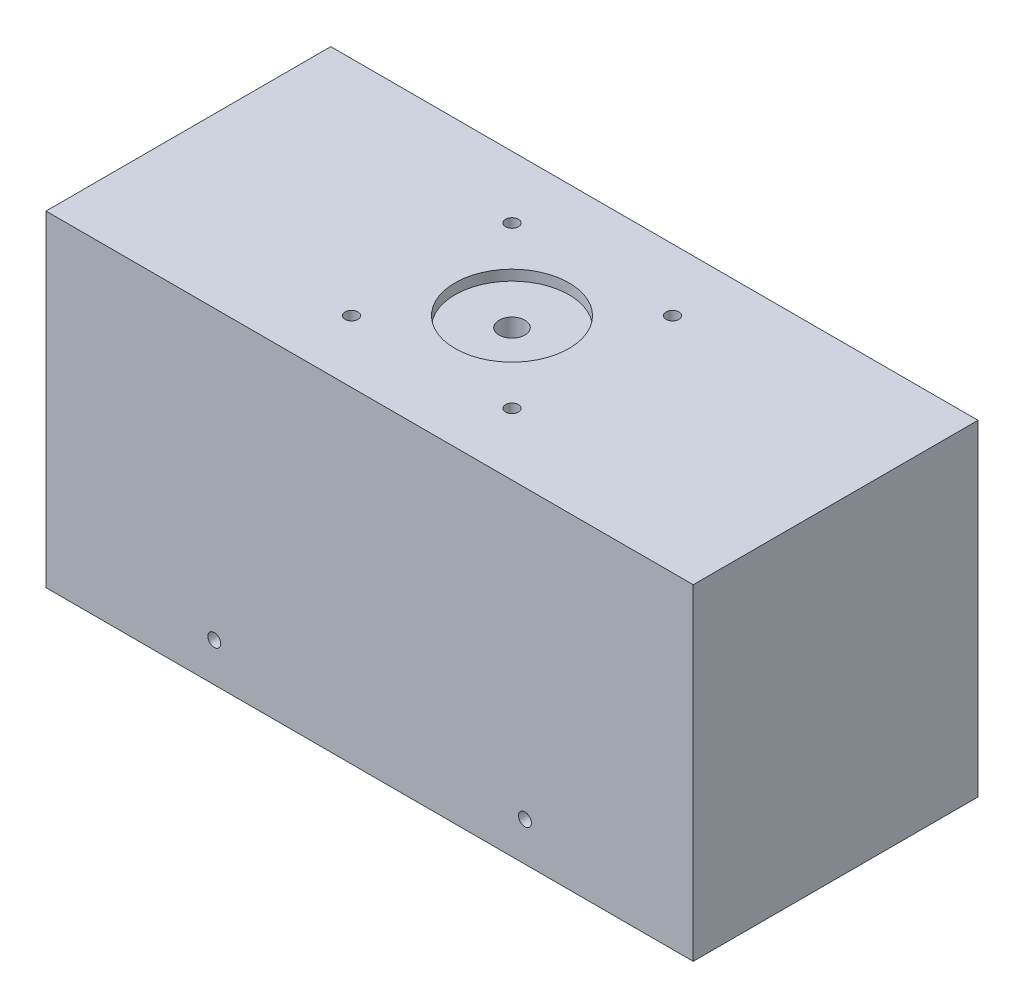
ISO-10303-21;
HEADER;
FILE_DESCRIPTION(('STEP AP214'),'2;1');
FILE_NAME('part.step','',(''),(''),'','','');
FILE_SCHEMA(('AUTOMOTIVE_DESIGN { 1 0 10303 214 1 1 1 1 }'));
ENDSEC;
DATA;
#1=APPLICATION_CONTEXT('core data for automotive mechanical design processes');
#2=APPLICATION_PROTOCOL_DEFINITION('international standard','automotive_design',2000,#1);
#3=PRODUCT_CONTEXT('',#1,'mechanical');
#4=PRODUCT('Part','Part','',(#3));
#5=PRODUCT_RELATED_PRODUCT_CATEGORY('part','',(#4));
#6=PRODUCT_DEFINITION_FORMATION('','',#4);
#7=PRODUCT_DEFINITION_CONTEXT('part definition',#1,'design');
#8=PRODUCT_DEFINITION('design','',#6,#7);
#9=PRODUCT_DEFINITION_SHAPE('','',#8);
#10=(LENGTH_UNIT() NAMED_UNIT(*) SI_UNIT(.MILLI.,.METRE.));
#11=(NAMED_UNIT(*) PLANE_ANGLE_UNIT() SI_UNIT($,.RADIAN.));
#12=(NAMED_UNIT(*) SI_UNIT($,.STERADIAN.) SOLID_ANGLE_UNIT());
#13=UNCERTAINTY_MEASURE_WITH_UNIT(LENGTH_MEASURE(1.E-05),#10,'distance_accuracy_value','');
#14=(GEOMETRIC_REPRESENTATION_CONTEXT(3) GLOBAL_UNCERTAINTY_ASSIGNED_CONTEXT((#13)) GLOBAL_UNIT_ASSIGNED_CONTEXT((#10,
#11,#12)) REPRESENTATION_CONTEXT('',''));
#15=CARTESIAN_POINT('',(0.,0.,0.));
#16=DIRECTION('',(0.,0.,1.));
#17=DIRECTION('',(1.,0.,0.));
#18=AXIS2_PLACEMENT_3D('',#15,#16,#17);
#19=CARTESIAN_POINT('',(-62.5,6.,27.5));
#20=DIRECTION('',(0.,0.,-1.));
#21=DIRECTION('',(-1.,0.,0.));
#22=AXIS2_PLACEMENT_3D('',#19,#20,#21);
#23=PLANE('',#22);
#24=DIRECTION('',(0.,-1.,0.));
#25=VECTOR('',#24,1.);
#26=CARTESIAN_POINT('',(-62.5,6.,27.5));
#27=LINE('',#26,#25);
#28=CARTESIAN_POINT('',(-62.5,6.,27.5));
#29=VERTEX_POINT('',#28);
#30=CARTESIAN_POINT('',(-62.5,-57.,27.5));
#31=VERTEX_POINT('',#30);
#32=EDGE_CURVE('E197',#29,#31,#27,.T.);
#33=ORIENTED_EDGE('',*,*,#32,.T.);
#34=DIRECTION('',(-1.,0.,0.));
#35=VECTOR('',#34,1.);
#36=CARTESIAN_POINT('',(62.5,-57.,27.5));
#37=LINE('',#36,#35);
#38=CARTESIAN_POINT('',(62.5,-57.,27.5));
#39=VERTEX_POINT('',#38);
#40=EDGE_CURVE('E156',#39,#31,#37,.T.);
#41=ORIENTED_EDGE('',*,*,#40,.F.);
#42=DIRECTION('',(0.,-1.,0.));
#43=VECTOR('',#42,1.);
#44=CARTESIAN_POINT('',(62.5,6.,27.5));
#45=LINE('',#44,#43);
#46=CARTESIAN_POINT('',(62.5,6.,27.5));
#47=VERTEX_POINT('',#46);
#48=EDGE_CURVE('E195',#47,#39,#45,.T.);
#49=ORIENTED_EDGE('',*,*,#48,.F.);
#50=DIRECTION('',(1.,0.,0.));
#51=VECTOR('',#50,1.);
#52=CARTESIAN_POINT('',(-62.5,6.,27.5));
#53=LINE('',#52,#51);
#54=EDGE_CURVE('E63',#29,#47,#53,.T.);
#55=ORIENTED_EDGE('',*,*,#54,.F.);
#56=EDGE_LOOP('',(#33,#41,#49,#55));
#57=FACE_BOUND('',#56,.T.);
#58=CARTESIAN_POINT('',(-30.,-49.5,27.5));
#59=DIRECTION('',(0.,0.,1.));
#60=DIRECTION('',(1.,0.,0.));
#61=AXIS2_PLACEMENT_3D('',#58,#59,#60);
#62=CIRCLE('',#61,1.24999999999999);
#63=CARTESIAN_POINT('',(-28.75,-49.5,27.5));
#64=VERTEX_POINT('',#63);
#65=EDGE_CURVE('E297',#64,#64,#62,.T.);
#66=ORIENTED_EDGE('',*,*,#65,.F.);
#67=EDGE_LOOP('',(#66));
#68=FACE_BOUND('',#67,.T.);
#69=CARTESIAN_POINT('',(30.,-49.5,27.5));
#70=DIRECTION('',(0.,0.,1.));
#71=DIRECTION('',(1.,0.,0.));
#72=AXIS2_PLACEMENT_3D('',#69,#70,#71);
#73=CIRCLE('',#72,1.24999999999999);
#74=CARTESIAN_POINT('',(31.25,-49.5,27.5));
#75=VERTEX_POINT('',#74);
#76=EDGE_CURVE('E293',#75,#75,#73,.T.);
#77=ORIENTED_EDGE('',*,*,#76,.F.);
#78=EDGE_LOOP('',(#77));
#79=FACE_BOUND('',#78,.T.);
#80=ADVANCED_FACE('F38',(#57,#68,#79),#23,.F.);
#81=CARTESIAN_POINT('',(-62.5,6.,-27.5));
#82=DIRECTION('',(0.,0.,1.));
#83=DIRECTION('',(1.,0.,0.));
#84=AXIS2_PLACEMENT_3D('',#81,#82,#83);
#85=PLANE('',#84);
#86=DIRECTION('',(0.,-1.,0.));
#87=VECTOR('',#86,1.);
#88=CARTESIAN_POINT('',(62.5,6.,-27.5));
#89=LINE('',#88,#87);
#90=CARTESIAN_POINT('',(62.5,6.,-27.5));
#91=VERTEX_POINT('',#90);
#92=CARTESIAN_POINT('',(62.5,-57.,-27.5));
#93=VERTEX_POINT('',#92);
#94=EDGE_CURVE('E11',#91,#93,#89,.T.);
#95=ORIENTED_EDGE('',*,*,#94,.T.);
#96=DIRECTION('',(1.,0.,0.));
#97=VECTOR('',#96,1.);
#98=CARTESIAN_POINT('',(62.5,-57.,-27.5));
#99=LINE('',#98,#97);
#100=CARTESIAN_POINT('',(-62.5,-57.,-27.5));
#101=VERTEX_POINT('',#100);
#102=EDGE_CURVE('E150',#101,#93,#99,.T.);
#103=ORIENTED_EDGE('',*,*,#102,.F.);
#104=DIRECTION('',(0.,-1.,0.));
#105=VECTOR('',#104,1.);
#106=CARTESIAN_POINT('',(-62.5,6.,-27.5));
#107=LINE('',#106,#105);
#108=CARTESIAN_POINT('',(-62.5,6.,-27.5));
#109=VERTEX_POINT('',#108);
#110=EDGE_CURVE('E47',#109,#101,#107,.T.);
#111=ORIENTED_EDGE('',*,*,#110,.F.);
#112=DIRECTION('',(-1.,0.,0.));
#113=VECTOR('',#112,1.);
#114=CARTESIAN_POINT('',(-62.5,6.,-27.5));
#115=LINE('',#114,#113);
#116=EDGE_CURVE('E190',#91,#109,#115,.T.);
#117=ORIENTED_EDGE('',*,*,#116,.F.);
#118=EDGE_LOOP('',(#95,#103,#111,#117));
#119=FACE_BOUND('',#118,.T.);
#120=CARTESIAN_POINT('',(30.,-49.5,-27.5));
#121=DIRECTION('',(0.,0.,-1.));
#122=DIRECTION('',(-1.,0.,0.));
#123=AXIS2_PLACEMENT_3D('',#120,#121,#122);
#124=CIRCLE('',#123,1.24999999999999);
#125=CARTESIAN_POINT('',(28.75,-49.5,-27.5));
#126=VERTEX_POINT('',#125);
#127=EDGE_CURVE('E312',#126,#126,#124,.T.);
#128=ORIENTED_EDGE('',*,*,#127,.F.);
#129=EDGE_LOOP('',(#128));
#130=FACE_BOUND('',#129,.T.);
#131=CARTESIAN_POINT('',(-30.,-49.5,-27.5));
#132=DIRECTION('',(0.,0.,-1.));
#133=DIRECTION('',(-1.,0.,0.));
#134=AXIS2_PLACEMENT_3D('',#131,#132,#133);
#135=CIRCLE('',#134,1.24999999999999);
#136=CARTESIAN_POINT('',(-31.25,-49.5,-27.5));
#137=VERTEX_POINT('',#136);
#138=EDGE_CURVE('E306',#137,#137,#135,.T.);
#139=ORIENTED_EDGE('',*,*,#138,.F.);
#140=EDGE_LOOP('',(#139));
#141=FACE_BOUND('',#140,.T.);
#142=ADVANCED_FACE('F223',(#119,#130,#141),#85,.F.);
#143=CARTESIAN_POINT('',(62.5,6.,-27.5));
#144=DIRECTION('',(-1.,0.,0.));
#145=DIRECTION('',(0.,0.,1.));
#146=AXIS2_PLACEMENT_3D('',#143,#144,#145);
#147=PLANE('',#146);
#148=ORIENTED_EDGE('',*,*,#48,.T.);
#149=DIRECTION('',(0.,0.,1.));
#150=VECTOR('',#149,1.);
#151=CARTESIAN_POINT('',(62.5,-57.,-27.5));
#152=LINE('',#151,#150);
#153=EDGE_CURVE('E153',#93,#39,#152,.T.);
#154=ORIENTED_EDGE('',*,*,#153,.F.);
#155=ORIENTED_EDGE('',*,*,#94,.F.);
#156=DIRECTION('',(0.,0.,-1.));
#157=VECTOR('',#156,1.);
#158=CARTESIAN_POINT('',(62.5,6.,-27.5));
#159=LINE('',#158,#157);
#160=EDGE_CURVE('E186',#47,#91,#159,.T.);
#161=ORIENTED_EDGE('',*,*,#160,.F.);
#162=EDGE_LOOP('',(#148,#154,#155,#161));
#163=FACE_BOUND('',#162,.T.);
#164=ADVANCED_FACE('F40',(#163),#147,.F.);
#165=CARTESIAN_POINT('',(-62.5,6.,-27.5));
#166=DIRECTION('',(1.,0.,0.));
#167=DIRECTION('',(0.,0.,-1.));
#168=AXIS2_PLACEMENT_3D('',#165,#166,#167);
#169=PLANE('',#168);
#170=ORIENTED_EDGE('',*,*,#110,.T.);
#171=DIRECTION('',(0.,0.,-1.));
#172=VECTOR('',#171,1.);
#173=CARTESIAN_POINT('',(-62.5,-57.,-27.5));
#174=LINE('',#173,#172);
#175=EDGE_CURVE('E122',#31,#101,#174,.T.);
#176=ORIENTED_EDGE('',*,*,#175,.F.);
#177=ORIENTED_EDGE('',*,*,#32,.F.);
#178=DIRECTION('',(0.,0.,1.));
#179=VECTOR('',#178,1.);
#180=CARTESIAN_POINT('',(-62.5,6.,-27.5));
#181=LINE('',#180,#179);
#182=EDGE_CURVE('E192',#109,#29,#181,.T.);
#183=ORIENTED_EDGE('',*,*,#182,.F.);
#184=EDGE_LOOP('',(#170,#176,#177,#183));
#185=FACE_BOUND('',#184,.T.);
#186=ADVANCED_FACE('F234',(#185),#169,.F.);
#187=CARTESIAN_POINT('',(0.,6.,0.));
#188=DIRECTION('',(0.,1.,0.));
#189=DIRECTION('',(0.,0.,1.));
#190=AXIS2_PLACEMENT_3D('',#187,#188,#189);
#191=PLANE('',#190);
#192=CARTESIAN_POINT('',(15.5,6.,-15.5));
#193=DIRECTION('',(0.,1.,0.));
#194=DIRECTION('',(0.,0.,1.));
#195=AXIS2_PLACEMENT_3D('',#192,#193,#194);
#196=CIRCLE('',#195,1.24999999999999);
#197=CARTESIAN_POINT('',(15.5,6.,-14.25));
#198=VERTEX_POINT('',#197);
#199=EDGE_CURVE('E159',#198,#198,#196,.T.);
#200=ORIENTED_EDGE('',*,*,#199,.F.);
#201=EDGE_LOOP('',(#200));
#202=FACE_BOUND('',#201,.T.);
#203=CARTESIAN_POINT('',(15.5,6.,15.5));
#204=DIRECTION('',(0.,1.,0.));
#205=DIRECTION('',(0.,0.,1.));
#206=AXIS2_PLACEMENT_3D('',#203,#204,#205);
#207=CIRCLE('',#206,1.24999999999999);
#208=CARTESIAN_POINT('',(15.5,6.,16.75));
#209=VERTEX_POINT('',#208);
#210=EDGE_CURVE('E162',#209,#209,#207,.T.);
#211=ORIENTED_EDGE('',*,*,#210,.F.);
#212=EDGE_LOOP('',(#211));
#213=FACE_BOUND('',#212,.T.);
#214=CARTESIAN_POINT('',(-15.5,6.,15.5));
#215=DIRECTION('',(0.,1.,0.));
#216=DIRECTION('',(0.,0.,1.));
#217=AXIS2_PLACEMENT_3D('',#214,#215,#216);
#218=CIRCLE('',#217,1.24999999999999);
#219=CARTESIAN_POINT('',(-15.5,6.,16.75));
#220=VERTEX_POINT('',#219);
#221=EDGE_CURVE('E166',#220,#220,#218,.T.);
#222=ORIENTED_EDGE('',*,*,#221,.F.);
#223=EDGE_LOOP('',(#222));
#224=FACE_BOUND('',#223,.T.);
#225=CARTESIAN_POINT('',(-15.5,6.,-15.5));
#226=DIRECTION('',(0.,1.,0.));
#227=DIRECTION('',(0.,0.,1.));
#228=AXIS2_PLACEMENT_3D('',#225,#226,#227);
#229=CIRCLE('',#228,1.24999999999999);
#230=CARTESIAN_POINT('',(-15.5,6.,-14.25));
#231=VERTEX_POINT('',#230);
#232=EDGE_CURVE('E172',#231,#231,#229,.T.);
#233=ORIENTED_EDGE('',*,*,#232,.F.);
#234=EDGE_LOOP('',(#233));
#235=FACE_BOUND('',#234,.T.);
#236=CARTESIAN_POINT('',(0.,6.,0.));
#237=DIRECTION('',(0.,1.,0.));
#238=DIRECTION('',(0.,0.,1.));
#239=AXIS2_PLACEMENT_3D('',#236,#237,#238);
#240=CIRCLE('',#239,11.);
#241=CARTESIAN_POINT('',(0.,6.,11.));
#242=VERTEX_POINT('',#241);
#243=EDGE_CURVE('E182',#242,#242,#240,.T.);
#244=ORIENTED_EDGE('',*,*,#243,.F.);
#245=EDGE_LOOP('',(#244));
#246=FACE_BOUND('',#245,.T.);
#247=ORIENTED_EDGE('',*,*,#160,.T.);
#248=ORIENTED_EDGE('',*,*,#116,.T.);
#249=ORIENTED_EDGE('',*,*,#182,.T.);
#250=ORIENTED_EDGE('',*,*,#54,.T.);
#251=EDGE_LOOP('',(#247,#248,#249,#250));
#252=FACE_BOUND('',#251,.T.);
#253=ADVANCED_FACE('F236',(#202,#213,#224,#235,#246,#252),#191,.T.);
#254=CARTESIAN_POINT('',(0.,0.,0.));
#255=DIRECTION('',(0.,1.,0.));
#256=DIRECTION('',(0.,0.,1.));
#257=AXIS2_PLACEMENT_3D('',#254,#255,#256);
#258=PLANE('',#257);
#259=DIRECTION('',(-1.,0.,0.));
#260=VECTOR('',#259,1.);
#261=CARTESIAN_POINT('',(60.,0.,25.));
#262=LINE('',#261,#260);
#263=CARTESIAN_POINT('',(60.,0.,25.));
#264=VERTEX_POINT('',#263);
#265=CARTESIAN_POINT('',(-60.,0.,25.));
#266=VERTEX_POINT('',#265);
#267=EDGE_CURVE('E115',#264,#266,#262,.T.);
#268=ORIENTED_EDGE('',*,*,#267,.T.);
#269=DIRECTION('',(0.,0.,-1.));
#270=VECTOR('',#269,1.);
#271=CARTESIAN_POINT('',(-60.,0.,-25.));
#272=LINE('',#271,#270);
#273=CARTESIAN_POINT('',(-60.,0.,-25.));
#274=VERTEX_POINT('',#273);
#275=EDGE_CURVE('E135',#266,#274,#272,.T.);
#276=ORIENTED_EDGE('',*,*,#275,.T.);
#277=DIRECTION('',(1.,0.,0.));
#278=VECTOR('',#277,1.);
#279=CARTESIAN_POINT('',(60.,0.,-25.));
#280=LINE('',#279,#278);
#281=CARTESIAN_POINT('',(60.,0.,-25.));
#282=VERTEX_POINT('',#281);
#283=EDGE_CURVE('E121',#274,#282,#280,.T.);
#284=ORIENTED_EDGE('',*,*,#283,.T.);
#285=DIRECTION('',(0.,0.,1.));
#286=VECTOR('',#285,1.);
#287=CARTESIAN_POINT('',(60.,0.,-25.));
#288=LINE('',#287,#286);
#289=EDGE_CURVE('E139',#282,#264,#288,.T.);
#290=ORIENTED_EDGE('',*,*,#289,.T.);
#291=EDGE_LOOP('',(#268,#276,#284,#290));
#292=FACE_BOUND('',#291,.T.);
#293=CARTESIAN_POINT('',(15.5,0.,-15.5));
#294=DIRECTION('',(0.,1.,0.));
#295=DIRECTION('',(0.,0.,1.));
#296=AXIS2_PLACEMENT_3D('',#293,#294,#295);
#297=CIRCLE('',#296,1.24999999999999);
#298=CARTESIAN_POINT('',(15.5,0.,-14.25));
#299=VERTEX_POINT('',#298);
#300=EDGE_CURVE('E42',#299,#299,#297,.T.);
#301=ORIENTED_EDGE('',*,*,#300,.T.);
#302=EDGE_LOOP('',(#301));
#303=FACE_BOUND('',#302,.T.);
#304=CARTESIAN_POINT('',(15.5,0.,15.5));
#305=DIRECTION('',(0.,1.,0.));
#306=DIRECTION('',(0.,0.,1.));
#307=AXIS2_PLACEMENT_3D('',#304,#305,#306);
#308=CIRCLE('',#307,1.24999999999999);
#309=CARTESIAN_POINT('',(15.5,0.,16.75));
#310=VERTEX_POINT('',#309);
#311=EDGE_CURVE('E165',#310,#310,#308,.T.);
#312=ORIENTED_EDGE('',*,*,#311,.T.);
#313=EDGE_LOOP('',(#312));
#314=FACE_BOUND('',#313,.T.);
#315=CARTESIAN_POINT('',(-15.5,0.,15.5));
#316=DIRECTION('',(0.,1.,0.));
#317=DIRECTION('',(0.,0.,1.));
#318=AXIS2_PLACEMENT_3D('',#315,#316,#317);
#319=CIRCLE('',#318,1.24999999999999);
#320=CARTESIAN_POINT('',(-15.5,0.,16.75));
#321=VERTEX_POINT('',#320);
#322=EDGE_CURVE('E169',#321,#321,#319,.T.);
#323=ORIENTED_EDGE('',*,*,#322,.T.);
#324=EDGE_LOOP('',(#323));
#325=FACE_BOUND('',#324,.T.);
#326=CARTESIAN_POINT('',(-15.5,0.,-15.5));
#327=DIRECTION('',(0.,1.,0.));
#328=DIRECTION('',(0.,0.,1.));
#329=AXIS2_PLACEMENT_3D('',#326,#327,#328);
#330=CIRCLE('',#329,1.24999999999999);
#331=CARTESIAN_POINT('',(-15.5,0.,-14.25));
#332=VERTEX_POINT('',#331);
#333=EDGE_CURVE('E175',#332,#332,#330,.T.);
#334=ORIENTED_EDGE('',*,*,#333,.T.);
#335=EDGE_LOOP('',(#334));
#336=FACE_BOUND('',#335,.T.);
#337=CARTESIAN_POINT('',(0.,0.,0.));
#338=DIRECTION('',(0.,1.,0.));
#339=DIRECTION('',(0.,0.,1.));
#340=AXIS2_PLACEMENT_3D('',#337,#338,#339);
#341=CIRCLE('',#340,2.5);
#342=CARTESIAN_POINT('',(0.,0.,2.5));
#343=VERTEX_POINT('',#342);
#344=EDGE_CURVE('E179',#343,#343,#341,.F.);
#345=ORIENTED_EDGE('',*,*,#344,.F.);
#346=EDGE_LOOP('',(#345));
#347=FACE_BOUND('',#346,.T.);
#348=ADVANCED_FACE('F204',(#292,#303,#314,#325,#336,#347),#258,.F.);
#349=CARTESIAN_POINT('',(0.,4.,0.));
#350=DIRECTION('',(0.,1.,0.));
#351=DIRECTION('',(0.,0.,1.));
#352=AXIS2_PLACEMENT_3D('',#349,#350,#351);
#353=CYLINDRICAL_SURFACE('',#352,11.);
#354=CARTESIAN_POINT('',(0.,4.,0.));
#355=DIRECTION('',(0.,1.,0.));
#356=DIRECTION('',(0.,0.,1.));
#357=AXIS2_PLACEMENT_3D('',#354,#355,#356);
#358=CIRCLE('',#357,11.);
#359=CARTESIAN_POINT('',(0.,4.,11.));
#360=VERTEX_POINT('',#359);
#361=EDGE_CURVE('E183',#360,#360,#358,.T.);
#362=ORIENTED_EDGE('',*,*,#361,.F.);
#363=EDGE_LOOP('',(#362));
#364=FACE_BOUND('',#363,.T.);
#365=ORIENTED_EDGE('',*,*,#243,.T.);
#366=EDGE_LOOP('',(#365));
#367=FACE_BOUND('',#366,.T.);
#368=ADVANCED_FACE('F330',(#364,#367),#353,.F.);
#369=CARTESIAN_POINT('',(0.,4.,0.));
#370=DIRECTION('',(0.,1.,0.));
#371=DIRECTION('',(0.,0.,1.));
#372=AXIS2_PLACEMENT_3D('',#369,#370,#371);
#373=PLANE('',#372);
#374=CARTESIAN_POINT('',(0.,4.,0.));
#375=DIRECTION('',(0.,1.,0.));
#376=DIRECTION('',(0.,0.,1.));
#377=AXIS2_PLACEMENT_3D('',#374,#375,#376);
#378=CIRCLE('',#377,2.5);
#379=CARTESIAN_POINT('',(0.,4.,2.5));
#380=VERTEX_POINT('',#379);
#381=EDGE_CURVE('E176',#380,#380,#378,.T.);
#382=ORIENTED_EDGE('',*,*,#381,.F.);
#383=EDGE_LOOP('',(#382));
#384=FACE_BOUND('',#383,.T.);
#385=ORIENTED_EDGE('',*,*,#361,.T.);
#386=EDGE_LOOP('',(#385));
#387=FACE_BOUND('',#386,.T.);
#388=ADVANCED_FACE('F337',(#384,#387),#373,.T.);
#389=CARTESIAN_POINT('',(0.,-0.00100000000000013,0.));
#390=DIRECTION('',(0.,1.,0.));
#391=DIRECTION('',(0.,0.,1.));
#392=AXIS2_PLACEMENT_3D('',#389,#390,#391);
#393=CYLINDRICAL_SURFACE('',#392,2.5);
#394=ORIENTED_EDGE('',*,*,#381,.T.);
#395=EDGE_LOOP('',(#394));
#396=FACE_BOUND('',#395,.T.);
#397=ORIENTED_EDGE('',*,*,#344,.T.);
#398=EDGE_LOOP('',(#397));
#399=FACE_BOUND('',#398,.T.);
#400=ADVANCED_FACE('F343',(#396,#399),#393,.F.);
#401=CARTESIAN_POINT('',(-15.5,6.,-15.5));
#402=DIRECTION('',(0.,1.,0.));
#403=DIRECTION('',(0.,0.,1.));
#404=AXIS2_PLACEMENT_3D('',#401,#402,#403);
#405=CYLINDRICAL_SURFACE('',#404,1.24999999999999);
#406=ORIENTED_EDGE('',*,*,#232,.T.);
#407=EDGE_LOOP('',(#406));
#408=FACE_BOUND('',#407,.T.);
#409=ORIENTED_EDGE('',*,*,#333,.F.);
#410=EDGE_LOOP('',(#409));
#411=FACE_BOUND('',#410,.T.);
#412=ADVANCED_FACE('F219',(#408,#411),#405,.F.);
#413=CARTESIAN_POINT('',(-15.5,6.,15.5));
#414=DIRECTION('',(0.,1.,0.));
#415=DIRECTION('',(0.,0.,1.));
#416=AXIS2_PLACEMENT_3D('',#413,#414,#415);
#417=CYLINDRICAL_SURFACE('',#416,1.24999999999999);
#418=ORIENTED_EDGE('',*,*,#221,.T.);
#419=EDGE_LOOP('',(#418));
#420=FACE_BOUND('',#419,.T.);
#421=ORIENTED_EDGE('',*,*,#322,.F.);
#422=EDGE_LOOP('',(#421));
#423=FACE_BOUND('',#422,.T.);
#424=ADVANCED_FACE('F210',(#420,#423),#417,.F.);
#425=CARTESIAN_POINT('',(15.5,6.,15.5));
#426=DIRECTION('',(0.,1.,0.));
#427=DIRECTION('',(0.,0.,1.));
#428=AXIS2_PLACEMENT_3D('',#425,#426,#427);
#429=CYLINDRICAL_SURFACE('',#428,1.24999999999999);
#430=ORIENTED_EDGE('',*,*,#210,.T.);
#431=EDGE_LOOP('',(#430));
#432=FACE_BOUND('',#431,.T.);
#433=ORIENTED_EDGE('',*,*,#311,.F.);
#434=EDGE_LOOP('',(#433));
#435=FACE_BOUND('',#434,.T.);
#436=ADVANCED_FACE('F207',(#432,#435),#429,.F.);
#437=CARTESIAN_POINT('',(15.5,6.,-15.5));
#438=DIRECTION('',(0.,1.,0.));
#439=DIRECTION('',(0.,0.,1.));
#440=AXIS2_PLACEMENT_3D('',#437,#438,#439);
#441=CYLINDRICAL_SURFACE('',#440,1.24999999999999);
#442=ORIENTED_EDGE('',*,*,#199,.T.);
#443=EDGE_LOOP('',(#442));
#444=FACE_BOUND('',#443,.T.);
#445=ORIENTED_EDGE('',*,*,#300,.F.);
#446=EDGE_LOOP('',(#445));
#447=FACE_BOUND('',#446,.T.);
#448=ADVANCED_FACE('F209',(#444,#447),#441,.F.);
#449=CARTESIAN_POINT('',(0.,-57.,0.));
#450=DIRECTION('',(0.,-1.,0.));
#451=DIRECTION('',(0.,0.,-1.));
#452=AXIS2_PLACEMENT_3D('',#449,#450,#451);
#453=PLANE('',#452);
#454=ORIENTED_EDGE('',*,*,#175,.T.);
#455=ORIENTED_EDGE('',*,*,#102,.T.);
#456=ORIENTED_EDGE('',*,*,#153,.T.);
#457=ORIENTED_EDGE('',*,*,#40,.T.);
#458=EDGE_LOOP('',(#454,#455,#456,#457));
#459=FACE_BOUND('',#458,.T.);
#460=DIRECTION('',(1.,0.,0.));
#461=VECTOR('',#460,1.);
#462=CARTESIAN_POINT('',(60.,-57.,-25.));
#463=LINE('',#462,#461);
#464=CARTESIAN_POINT('',(-60.,-57.,-25.));
#465=VERTEX_POINT('',#464);
#466=CARTESIAN_POINT('',(60.,-57.,-25.));
#467=VERTEX_POINT('',#466);
#468=EDGE_CURVE('E114',#465,#467,#463,.T.);
#469=ORIENTED_EDGE('',*,*,#468,.F.);
#470=DIRECTION('',(0.,0.,-1.));
#471=VECTOR('',#470,1.);
#472=CARTESIAN_POINT('',(-60.,-57.,-25.));
#473=LINE('',#472,#471);
#474=CARTESIAN_POINT('',(-60.,-57.,25.));
#475=VERTEX_POINT('',#474);
#476=EDGE_CURVE('E106',#475,#465,#473,.T.);
#477=ORIENTED_EDGE('',*,*,#476,.F.);
#478=DIRECTION('',(-1.,0.,0.));
#479=VECTOR('',#478,1.);
#480=CARTESIAN_POINT('',(60.,-57.,25.));
#481=LINE('',#480,#479);
#482=CARTESIAN_POINT('',(60.,-57.,25.));
#483=VERTEX_POINT('',#482);
#484=EDGE_CURVE('E130',#483,#475,#481,.T.);
#485=ORIENTED_EDGE('',*,*,#484,.F.);
#486=DIRECTION('',(0.,0.,1.));
#487=VECTOR('',#486,1.);
#488=CARTESIAN_POINT('',(60.,-57.,-25.));
#489=LINE('',#488,#487);
#490=EDGE_CURVE('E128',#467,#483,#489,.T.);
#491=ORIENTED_EDGE('',*,*,#490,.F.);
#492=EDGE_LOOP('',(#469,#477,#485,#491));
#493=FACE_BOUND('',#492,.T.);
#494=ADVANCED_FACE('F126',(#459,#493),#453,.T.);
#495=CARTESIAN_POINT('',(-60.,-57.,-25.));
#496=DIRECTION('',(1.,0.,0.));
#497=DIRECTION('',(0.,0.,-1.));
#498=AXIS2_PLACEMENT_3D('',#495,#496,#497);
#499=PLANE('',#498);
#500=ORIENTED_EDGE('',*,*,#275,.F.);
#501=DIRECTION('',(0.,1.,0.));
#502=VECTOR('',#501,1.);
#503=CARTESIAN_POINT('',(-60.,-57.,25.));
#504=LINE('',#503,#502);
#505=EDGE_CURVE('E55',#475,#266,#504,.T.);
#506=ORIENTED_EDGE('',*,*,#505,.F.);
#507=ORIENTED_EDGE('',*,*,#476,.T.);
#508=DIRECTION('',(0.,1.,0.));
#509=VECTOR('',#508,1.);
#510=CARTESIAN_POINT('',(-60.,-57.,-25.));
#511=LINE('',#510,#509);
#512=EDGE_CURVE('E109',#465,#274,#511,.T.);
#513=ORIENTED_EDGE('',*,*,#512,.T.);
#514=EDGE_LOOP('',(#500,#506,#507,#513));
#515=FACE_BOUND('',#514,.T.);
#516=ADVANCED_FACE('F108',(#515),#499,.T.);
#517=CARTESIAN_POINT('',(60.,-57.,-25.));
#518=DIRECTION('',(0.,0.,1.));
#519=DIRECTION('',(1.,0.,0.));
#520=AXIS2_PLACEMENT_3D('',#517,#518,#519);
#521=PLANE('',#520);
#522=CARTESIAN_POINT('',(-30.,-49.5,-25.));
#523=DIRECTION('',(0.,0.,1.));
#524=DIRECTION('',(1.,0.,0.));
#525=AXIS2_PLACEMENT_3D('',#522,#523,#524);
#526=CIRCLE('',#525,1.24999999999999);
#527=CARTESIAN_POINT('',(-28.75,-49.5,-25.));
#528=VERTEX_POINT('',#527);
#529=EDGE_CURVE('E309',#528,#528,#526,.T.);
#530=ORIENTED_EDGE('',*,*,#529,.F.);
#531=EDGE_LOOP('',(#530));
#532=FACE_BOUND('',#531,.T.);
#533=CARTESIAN_POINT('',(30.,-49.5,-25.));
#534=DIRECTION('',(0.,0.,1.));
#535=DIRECTION('',(1.,0.,0.));
#536=AXIS2_PLACEMENT_3D('',#533,#534,#535);
#537=CIRCLE('',#536,1.24999999999999);
#538=CARTESIAN_POINT('',(31.25,-49.5,-25.));
#539=VERTEX_POINT('',#538);
#540=EDGE_CURVE('E137',#539,#539,#537,.T.);
#541=ORIENTED_EDGE('',*,*,#540,.F.);
#542=EDGE_LOOP('',(#541));
#543=FACE_BOUND('',#542,.T.);
#544=ORIENTED_EDGE('',*,*,#283,.F.);
#545=ORIENTED_EDGE('',*,*,#512,.F.);
#546=ORIENTED_EDGE('',*,*,#468,.T.);
#547=DIRECTION('',(0.,1.,0.));
#548=VECTOR('',#547,1.);
#549=CARTESIAN_POINT('',(60.,-57.,-25.));
#550=LINE('',#549,#548);
#551=EDGE_CURVE('E123',#467,#282,#550,.T.);
#552=ORIENTED_EDGE('',*,*,#551,.T.);
#553=EDGE_LOOP('',(#544,#545,#546,#552));
#554=FACE_BOUND('',#553,.T.);
#555=ADVANCED_FACE('F118',(#532,#543,#554),#521,.T.);
#556=CARTESIAN_POINT('',(60.,-57.,-25.));
#557=DIRECTION('',(-1.,0.,0.));
#558=DIRECTION('',(0.,0.,1.));
#559=AXIS2_PLACEMENT_3D('',#556,#557,#558);
#560=PLANE('',#559);
#561=ORIENTED_EDGE('',*,*,#289,.F.);
#562=ORIENTED_EDGE('',*,*,#551,.F.);
#563=ORIENTED_EDGE('',*,*,#490,.T.);
#564=DIRECTION('',(0.,1.,0.));
#565=VECTOR('',#564,1.);
#566=CARTESIAN_POINT('',(60.,-57.,25.));
#567=LINE('',#566,#565);
#568=EDGE_CURVE('E145',#483,#264,#567,.T.);
#569=ORIENTED_EDGE('',*,*,#568,.T.);
#570=EDGE_LOOP('',(#561,#562,#563,#569));
#571=FACE_BOUND('',#570,.T.);
#572=ADVANCED_FACE('F264',(#571),#560,.T.);
#573=CARTESIAN_POINT('',(60.,-57.,25.));
#574=DIRECTION('',(0.,0.,-1.));
#575=DIRECTION('',(-1.,0.,0.));
#576=AXIS2_PLACEMENT_3D('',#573,#574,#575);
#577=PLANE('',#576);
#578=CARTESIAN_POINT('',(30.,-49.5,25.));
#579=DIRECTION('',(0.,0.,-1.));
#580=DIRECTION('',(-1.,0.,0.));
#581=AXIS2_PLACEMENT_3D('',#578,#579,#580);
#582=CIRCLE('',#581,1.24999999999999);
#583=CARTESIAN_POINT('',(28.75,-49.5,25.));
#584=VERTEX_POINT('',#583);
#585=EDGE_CURVE('E296',#584,#584,#582,.T.);
#586=ORIENTED_EDGE('',*,*,#585,.F.);
#587=EDGE_LOOP('',(#586));
#588=FACE_BOUND('',#587,.T.);
#589=CARTESIAN_POINT('',(-30.,-49.5,25.));
#590=DIRECTION('',(0.,0.,-1.));
#591=DIRECTION('',(-1.,0.,0.));
#592=AXIS2_PLACEMENT_3D('',#589,#590,#591);
#593=CIRCLE('',#592,1.24999999999999);
#594=CARTESIAN_POINT('',(-31.25,-49.5,25.));
#595=VERTEX_POINT('',#594);
#596=EDGE_CURVE('E300',#595,#595,#593,.T.);
#597=ORIENTED_EDGE('',*,*,#596,.F.);
#598=EDGE_LOOP('',(#597));
#599=FACE_BOUND('',#598,.T.);
#600=ORIENTED_EDGE('',*,*,#267,.F.);
#601=ORIENTED_EDGE('',*,*,#568,.F.);
#602=ORIENTED_EDGE('',*,*,#484,.T.);
#603=ORIENTED_EDGE('',*,*,#505,.T.);
#604=EDGE_LOOP('',(#600,#601,#602,#603));
#605=FACE_BOUND('',#604,.T.);
#606=ADVANCED_FACE('F268',(#588,#599,#605),#577,.T.);
#607=CARTESIAN_POINT('',(30.,-49.5,-27.5));
#608=DIRECTION('',(0.,0.,-1.));
#609=DIRECTION('',(-1.,0.,0.));
#610=AXIS2_PLACEMENT_3D('',#607,#608,#609);
#611=CYLINDRICAL_SURFACE('',#610,1.24999999999999);
#612=ORIENTED_EDGE('',*,*,#127,.T.);
#613=EDGE_LOOP('',(#612));
#614=FACE_BOUND('',#613,.T.);
#615=ORIENTED_EDGE('',*,*,#540,.T.);
#616=EDGE_LOOP('',(#615));
#617=FACE_BOUND('',#616,.T.);
#618=ADVANCED_FACE('F272',(#614,#617),#611,.F.);
#619=CARTESIAN_POINT('',(-30.,-49.5,-27.5));
#620=DIRECTION('',(0.,0.,-1.));
#621=DIRECTION('',(-1.,0.,0.));
#622=AXIS2_PLACEMENT_3D('',#619,#620,#621);
#623=CYLINDRICAL_SURFACE('',#622,1.24999999999999);
#624=ORIENTED_EDGE('',*,*,#138,.T.);
#625=EDGE_LOOP('',(#624));
#626=FACE_BOUND('',#625,.T.);
#627=ORIENTED_EDGE('',*,*,#529,.T.);
#628=EDGE_LOOP('',(#627));
#629=FACE_BOUND('',#628,.T.);
#630=ADVANCED_FACE('F276',(#626,#629),#623,.F.);
#631=CARTESIAN_POINT('',(-30.,-49.5,27.5));
#632=DIRECTION('',(0.,0.,1.));
#633=DIRECTION('',(1.,0.,0.));
#634=AXIS2_PLACEMENT_3D('',#631,#632,#633);
#635=CYLINDRICAL_SURFACE('',#634,1.24999999999999);
#636=ORIENTED_EDGE('',*,*,#65,.T.);
#637=EDGE_LOOP('',(#636));
#638=FACE_BOUND('',#637,.T.);
#639=ORIENTED_EDGE('',*,*,#596,.T.);
#640=EDGE_LOOP('',(#639));
#641=FACE_BOUND('',#640,.T.);
#642=ADVANCED_FACE('F280',(#638,#641),#635,.F.);
#643=CARTESIAN_POINT('',(30.,-49.5,27.5));
#644=DIRECTION('',(0.,0.,1.));
#645=DIRECTION('',(1.,0.,0.));
#646=AXIS2_PLACEMENT_3D('',#643,#644,#645);
#647=CYLINDRICAL_SURFACE('',#646,1.24999999999999);
#648=ORIENTED_EDGE('',*,*,#76,.T.);
#649=EDGE_LOOP('',(#648));
#650=FACE_BOUND('',#649,.T.);
#651=ORIENTED_EDGE('',*,*,#585,.T.);
#652=EDGE_LOOP('',(#651));
#653=FACE_BOUND('',#652,.T.);
#654=ADVANCED_FACE('F284',(#650,#653),#647,.F.);
#655=CLOSED_SHELL('',(#80,#142,#164,#186,#253,#348,#368,#388,#400,#412,#424,#436,#448,#494,#516,
#555,#572,#606,#618,#630,#642,#654));
#656=MANIFOLD_SOLID_BREP('B2',#655);
#657=ADVANCED_BREP_SHAPE_REPRESENTATION('',(#18,#656),#14);
#658=SHAPE_DEFINITION_REPRESENTATION(#9,#657);
ENDSEC;
END-ISO-10303-21;
